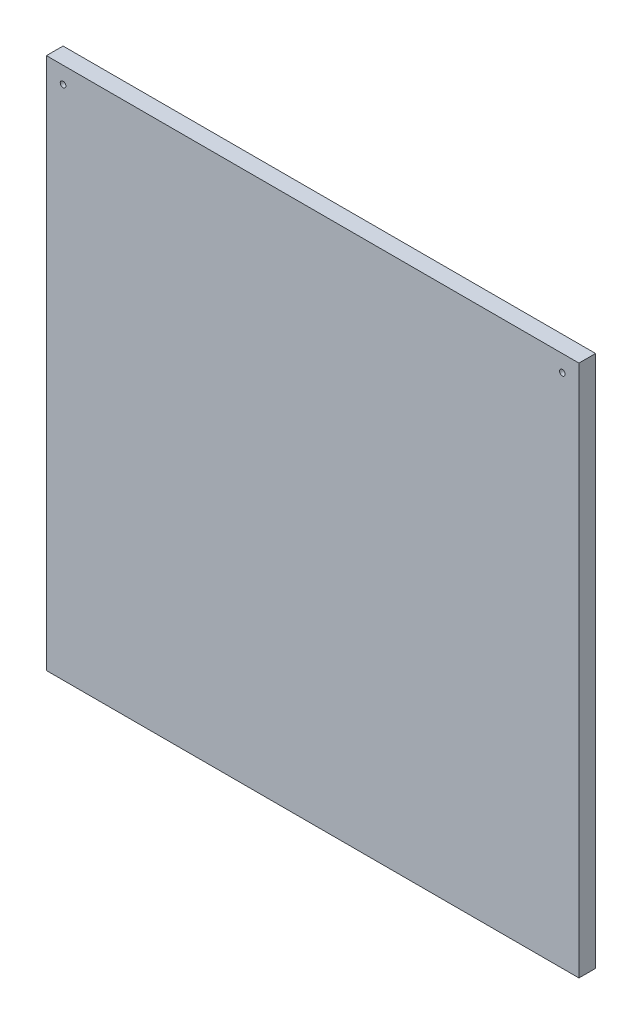
ISO-10303-21;
HEADER;
FILE_DESCRIPTION(('STEP AP214'),'2;1');
FILE_NAME('part.step','',(''),(''),'','','');
FILE_SCHEMA(('AUTOMOTIVE_DESIGN { 1 0 10303 214 1 1 1 1 }'));
ENDSEC;
DATA;
#1=APPLICATION_CONTEXT('core data for automotive mechanical design processes');
#2=APPLICATION_PROTOCOL_DEFINITION('international standard','automotive_design',2000,#1);
#3=PRODUCT_CONTEXT('',#1,'mechanical');
#4=PRODUCT('Part','Part','',(#3));
#5=PRODUCT_RELATED_PRODUCT_CATEGORY('part','',(#4));
#6=PRODUCT_DEFINITION_FORMATION('','',#4);
#7=PRODUCT_DEFINITION_CONTEXT('part definition',#1,'design');
#8=PRODUCT_DEFINITION('design','',#6,#7);
#9=PRODUCT_DEFINITION_SHAPE('','',#8);
#10=(LENGTH_UNIT() NAMED_UNIT(*) SI_UNIT(.MILLI.,.METRE.));
#11=(NAMED_UNIT(*) PLANE_ANGLE_UNIT() SI_UNIT($,.RADIAN.));
#12=(NAMED_UNIT(*) SI_UNIT($,.STERADIAN.) SOLID_ANGLE_UNIT());
#13=UNCERTAINTY_MEASURE_WITH_UNIT(LENGTH_MEASURE(1.E-05),#10,'distance_accuracy_value','');
#14=(GEOMETRIC_REPRESENTATION_CONTEXT(3) GLOBAL_UNCERTAINTY_ASSIGNED_CONTEXT((#13)) GLOBAL_UNIT_ASSIGNED_CONTEXT((#10,
#11,#12)) REPRESENTATION_CONTEXT('',''));
#15=CARTESIAN_POINT('',(0.,0.,0.));
#16=DIRECTION('',(0.,0.,1.));
#17=DIRECTION('',(1.,0.,0.));
#18=AXIS2_PLACEMENT_3D('',#15,#16,#17);
#19=CARTESIAN_POINT('',(400.,-400.,25.));
#20=DIRECTION('',(-1.,0.,0.));
#21=DIRECTION('',(0.,0.,1.));
#22=AXIS2_PLACEMENT_3D('',#19,#20,#21);
#23=PLANE('',#22);
#24=DIRECTION('',(0.,1.,0.));
#25=VECTOR('',#24,1.);
#26=CARTESIAN_POINT('',(400.,-400.,0.));
#27=LINE('',#26,#25);
#28=CARTESIAN_POINT('',(400.,-400.,0.));
#29=VERTEX_POINT('',#28);
#30=CARTESIAN_POINT('',(400.,400.,0.));
#31=VERTEX_POINT('',#30);
#32=EDGE_CURVE('E105',#29,#31,#27,.T.);
#33=ORIENTED_EDGE('',*,*,#32,.T.);
#34=DIRECTION('',(0.,0.,-1.));
#35=VECTOR('',#34,1.);
#36=CARTESIAN_POINT('',(400.,400.,25.));
#37=LINE('',#36,#35);
#38=CARTESIAN_POINT('',(400.,400.,25.));
#39=VERTEX_POINT('',#38);
#40=EDGE_CURVE('E11',#39,#31,#37,.T.);
#41=ORIENTED_EDGE('',*,*,#40,.F.);
#42=DIRECTION('',(0.,1.,0.));
#43=VECTOR('',#42,1.);
#44=CARTESIAN_POINT('',(400.,-400.,25.));
#45=LINE('',#44,#43);
#46=CARTESIAN_POINT('',(400.,-400.,25.));
#47=VERTEX_POINT('',#46);
#48=EDGE_CURVE('E89',#47,#39,#45,.T.);
#49=ORIENTED_EDGE('',*,*,#48,.F.);
#50=DIRECTION('',(0.,0.,-1.));
#51=VECTOR('',#50,1.);
#52=CARTESIAN_POINT('',(400.,-400.,25.));
#53=LINE('',#52,#51);
#54=EDGE_CURVE('E98',#47,#29,#53,.T.);
#55=ORIENTED_EDGE('',*,*,#54,.T.);
#56=EDGE_LOOP('',(#33,#41,#49,#55));
#57=FACE_BOUND('',#56,.T.);
#58=ADVANCED_FACE('F39',(#57),#23,.F.);
#59=CARTESIAN_POINT('',(-400.,400.,25.));
#60=DIRECTION('',(0.,-1.,0.));
#61=DIRECTION('',(0.,0.,-1.));
#62=AXIS2_PLACEMENT_3D('',#59,#60,#61);
#63=PLANE('',#62);
#64=DIRECTION('',(-1.,0.,0.));
#65=VECTOR('',#64,1.);
#66=CARTESIAN_POINT('',(-400.,400.,0.));
#67=LINE('',#66,#65);
#68=CARTESIAN_POINT('',(-400.,400.,0.));
#69=VERTEX_POINT('',#68);
#70=EDGE_CURVE('E94',#31,#69,#67,.T.);
#71=ORIENTED_EDGE('',*,*,#70,.T.);
#72=DIRECTION('',(0.,0.,-1.));
#73=VECTOR('',#72,1.);
#74=CARTESIAN_POINT('',(-400.,400.,25.));
#75=LINE('',#74,#73);
#76=CARTESIAN_POINT('',(-400.,400.,25.));
#77=VERTEX_POINT('',#76);
#78=EDGE_CURVE('E50',#77,#69,#75,.T.);
#79=ORIENTED_EDGE('',*,*,#78,.F.);
#80=DIRECTION('',(-1.,0.,0.));
#81=VECTOR('',#80,1.);
#82=CARTESIAN_POINT('',(-400.,400.,25.));
#83=LINE('',#82,#81);
#84=EDGE_CURVE('E83',#39,#77,#83,.T.);
#85=ORIENTED_EDGE('',*,*,#84,.F.);
#86=ORIENTED_EDGE('',*,*,#40,.T.);
#87=EDGE_LOOP('',(#71,#79,#85,#86));
#88=FACE_BOUND('',#87,.T.);
#89=ADVANCED_FACE('F91',(#88),#63,.F.);
#90=CARTESIAN_POINT('',(-400.,-400.,25.));
#91=DIRECTION('',(1.,0.,0.));
#92=DIRECTION('',(0.,0.,-1.));
#93=AXIS2_PLACEMENT_3D('',#90,#91,#92);
#94=PLANE('',#93);
#95=DIRECTION('',(0.,-1.,0.));
#96=VECTOR('',#95,1.);
#97=CARTESIAN_POINT('',(-400.,-400.,0.));
#98=LINE('',#97,#96);
#99=CARTESIAN_POINT('',(-400.,-400.,0.));
#100=VERTEX_POINT('',#99);
#101=EDGE_CURVE('E75',#69,#100,#98,.T.);
#102=ORIENTED_EDGE('',*,*,#101,.T.);
#103=DIRECTION('',(0.,0.,-1.));
#104=VECTOR('',#103,1.);
#105=CARTESIAN_POINT('',(-400.,-400.,25.));
#106=LINE('',#105,#104);
#107=CARTESIAN_POINT('',(-400.,-400.,25.));
#108=VERTEX_POINT('',#107);
#109=EDGE_CURVE('E92',#108,#100,#106,.T.);
#110=ORIENTED_EDGE('',*,*,#109,.F.);
#111=DIRECTION('',(0.,-1.,0.));
#112=VECTOR('',#111,1.);
#113=CARTESIAN_POINT('',(-400.,-400.,25.));
#114=LINE('',#113,#112);
#115=EDGE_CURVE('E86',#77,#108,#114,.T.);
#116=ORIENTED_EDGE('',*,*,#115,.F.);
#117=ORIENTED_EDGE('',*,*,#78,.T.);
#118=EDGE_LOOP('',(#102,#110,#116,#117));
#119=FACE_BOUND('',#118,.T.);
#120=ADVANCED_FACE('F96',(#119),#94,.F.);
#121=CARTESIAN_POINT('',(-400.,-400.,25.));
#122=DIRECTION('',(0.,1.,0.));
#123=DIRECTION('',(0.,0.,1.));
#124=AXIS2_PLACEMENT_3D('',#121,#122,#123);
#125=PLANE('',#124);
#126=DIRECTION('',(1.,0.,0.));
#127=VECTOR('',#126,1.);
#128=CARTESIAN_POINT('',(-400.,-400.,0.));
#129=LINE('',#128,#127);
#130=EDGE_CURVE('E77',#100,#29,#129,.T.);
#131=ORIENTED_EDGE('',*,*,#130,.T.);
#132=ORIENTED_EDGE('',*,*,#54,.F.);
#133=DIRECTION('',(1.,0.,0.));
#134=VECTOR('',#133,1.);
#135=CARTESIAN_POINT('',(-400.,-400.,25.));
#136=LINE('',#135,#134);
#137=EDGE_CURVE('E54',#108,#47,#136,.T.);
#138=ORIENTED_EDGE('',*,*,#137,.F.);
#139=ORIENTED_EDGE('',*,*,#109,.T.);
#140=EDGE_LOOP('',(#131,#132,#138,#139));
#141=FACE_BOUND('',#140,.T.);
#142=ADVANCED_FACE('F109',(#141),#125,.F.);
#143=CARTESIAN_POINT('',(0.,0.,25.));
#144=DIRECTION('',(0.,0.,-1.));
#145=DIRECTION('',(-1.,0.,0.));
#146=AXIS2_PLACEMENT_3D('',#143,#144,#145);
#147=PLANE('',#146);
#148=CARTESIAN_POINT('',(375.,375.,25.));
#149=DIRECTION('',(0.,0.,1.));
#150=DIRECTION('',(1.,0.,0.));
#151=AXIS2_PLACEMENT_3D('',#148,#149,#150);
#152=CIRCLE('',#151,4.24999999999995);
#153=CARTESIAN_POINT('',(379.25,375.,25.));
#154=VERTEX_POINT('',#153);
#155=EDGE_CURVE('E125',#154,#154,#152,.T.);
#156=ORIENTED_EDGE('',*,*,#155,.F.);
#157=EDGE_LOOP('',(#156));
#158=FACE_BOUND('',#157,.T.);
#159=CARTESIAN_POINT('',(-375.,375.,25.));
#160=DIRECTION('',(0.,0.,1.));
#161=DIRECTION('',(1.,0.,0.));
#162=AXIS2_PLACEMENT_3D('',#159,#160,#161);
#163=CIRCLE('',#162,4.24999999999995);
#164=CARTESIAN_POINT('',(-370.75,375.,25.));
#165=VERTEX_POINT('',#164);
#166=EDGE_CURVE('E120',#165,#165,#163,.T.);
#167=ORIENTED_EDGE('',*,*,#166,.F.);
#168=EDGE_LOOP('',(#167));
#169=FACE_BOUND('',#168,.T.);
#170=ORIENTED_EDGE('',*,*,#48,.T.);
#171=ORIENTED_EDGE('',*,*,#84,.T.);
#172=ORIENTED_EDGE('',*,*,#115,.T.);
#173=ORIENTED_EDGE('',*,*,#137,.T.);
#174=EDGE_LOOP('',(#170,#171,#172,#173));
#175=FACE_BOUND('',#174,.T.);
#176=ADVANCED_FACE('F88',(#158,#169,#175),#147,.F.);
#177=CARTESIAN_POINT('',(0.,0.,0.));
#178=DIRECTION('',(0.,0.,-1.));
#179=DIRECTION('',(-1.,0.,0.));
#180=AXIS2_PLACEMENT_3D('',#177,#178,#179);
#181=PLANE('',#180);
#182=CARTESIAN_POINT('',(375.,375.,0.));
#183=DIRECTION('',(0.,0.,1.));
#184=DIRECTION('',(1.,0.,0.));
#185=AXIS2_PLACEMENT_3D('',#182,#183,#184);
#186=CIRCLE('',#185,4.24999999999995);
#187=CARTESIAN_POINT('',(379.25,375.,0.));
#188=VERTEX_POINT('',#187);
#189=EDGE_CURVE('E104',#188,#188,#186,.T.);
#190=ORIENTED_EDGE('',*,*,#189,.T.);
#191=EDGE_LOOP('',(#190));
#192=FACE_BOUND('',#191,.T.);
#193=CARTESIAN_POINT('',(-375.,375.,0.));
#194=DIRECTION('',(0.,0.,1.));
#195=DIRECTION('',(1.,0.,0.));
#196=AXIS2_PLACEMENT_3D('',#193,#194,#195);
#197=CIRCLE('',#196,4.24999999999995);
#198=CARTESIAN_POINT('',(-370.75,375.,0.));
#199=VERTEX_POINT('',#198);
#200=EDGE_CURVE('E118',#199,#199,#197,.T.);
#201=ORIENTED_EDGE('',*,*,#200,.T.);
#202=EDGE_LOOP('',(#201));
#203=FACE_BOUND('',#202,.T.);
#204=ORIENTED_EDGE('',*,*,#32,.F.);
#205=ORIENTED_EDGE('',*,*,#130,.F.);
#206=ORIENTED_EDGE('',*,*,#101,.F.);
#207=ORIENTED_EDGE('',*,*,#70,.F.);
#208=EDGE_LOOP('',(#204,#205,#206,#207));
#209=FACE_BOUND('',#208,.T.);
#210=ADVANCED_FACE('F114',(#192,#203,#209),#181,.T.);
#211=CARTESIAN_POINT('',(-375.,375.,0.));
#212=DIRECTION('',(0.,0.,1.));
#213=DIRECTION('',(1.,0.,0.));
#214=AXIS2_PLACEMENT_3D('',#211,#212,#213);
#215=CYLINDRICAL_SURFACE('',#214,4.24999999999995);
#216=ORIENTED_EDGE('',*,*,#200,.F.);
#217=EDGE_LOOP('',(#216));
#218=FACE_BOUND('',#217,.T.);
#219=ORIENTED_EDGE('',*,*,#166,.T.);
#220=EDGE_LOOP('',(#219));
#221=FACE_BOUND('',#220,.T.);
#222=ADVANCED_FACE('F132',(#218,#221),#215,.F.);
#223=CARTESIAN_POINT('',(375.,375.,0.));
#224=DIRECTION('',(0.,0.,1.));
#225=DIRECTION('',(1.,0.,0.));
#226=AXIS2_PLACEMENT_3D('',#223,#224,#225);
#227=CYLINDRICAL_SURFACE('',#226,4.24999999999995);
#228=ORIENTED_EDGE('',*,*,#189,.F.);
#229=EDGE_LOOP('',(#228));
#230=FACE_BOUND('',#229,.T.);
#231=ORIENTED_EDGE('',*,*,#155,.T.);
#232=EDGE_LOOP('',(#231));
#233=FACE_BOUND('',#232,.T.);
#234=ADVANCED_FACE('F128',(#230,#233),#227,.F.);
#235=CLOSED_SHELL('',(#58,#89,#120,#142,#176,#210,#222,#234));
#236=MANIFOLD_SOLID_BREP('B2',#235);
#237=ADVANCED_BREP_SHAPE_REPRESENTATION('',(#18,#236),#14);
#238=SHAPE_DEFINITION_REPRESENTATION(#9,#237);
ENDSEC;
END-ISO-10303-21;
